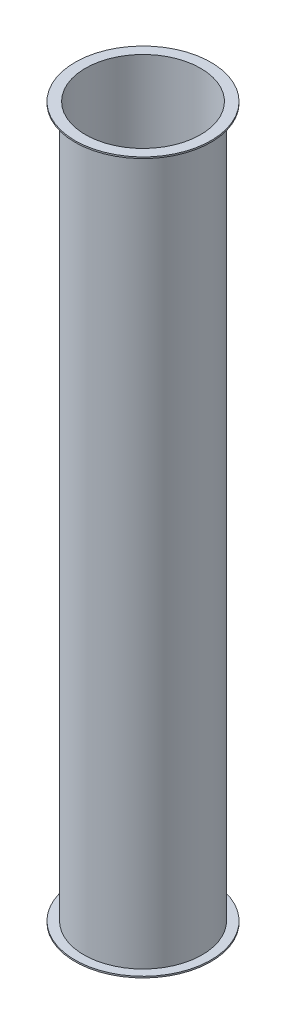
ISO-10303-21;
HEADER;
FILE_DESCRIPTION(('STEP AP214'),'2;1');
FILE_NAME('part.step','',(''),(''),'','','');
FILE_SCHEMA(('AUTOMOTIVE_DESIGN { 1 0 10303 214 1 1 1 1 }'));
ENDSEC;
DATA;
#1=APPLICATION_CONTEXT('core data for automotive mechanical design processes');
#2=APPLICATION_PROTOCOL_DEFINITION('international standard','automotive_design',2000,#1);
#3=PRODUCT_CONTEXT('',#1,'mechanical');
#4=PRODUCT('Part','Part','',(#3));
#5=PRODUCT_RELATED_PRODUCT_CATEGORY('part','',(#4));
#6=PRODUCT_DEFINITION_FORMATION('','',#4);
#7=PRODUCT_DEFINITION_CONTEXT('part definition',#1,'design');
#8=PRODUCT_DEFINITION('design','',#6,#7);
#9=PRODUCT_DEFINITION_SHAPE('','',#8);
#10=(LENGTH_UNIT() NAMED_UNIT(*) SI_UNIT(.MILLI.,.METRE.));
#11=(NAMED_UNIT(*) PLANE_ANGLE_UNIT() SI_UNIT($,.RADIAN.));
#12=(NAMED_UNIT(*) SI_UNIT($,.STERADIAN.) SOLID_ANGLE_UNIT());
#13=UNCERTAINTY_MEASURE_WITH_UNIT(LENGTH_MEASURE(1.E-05),#10,'distance_accuracy_value','');
#14=(GEOMETRIC_REPRESENTATION_CONTEXT(3) GLOBAL_UNCERTAINTY_ASSIGNED_CONTEXT((#13)) GLOBAL_UNIT_ASSIGNED_CONTEXT((#10,
#11,#12)) REPRESENTATION_CONTEXT('',''));
#15=CARTESIAN_POINT('',(0.,0.,0.));
#16=DIRECTION('',(0.,0.,1.));
#17=DIRECTION('',(1.,0.,0.));
#18=AXIS2_PLACEMENT_3D('',#15,#16,#17);
#19=CARTESIAN_POINT('',(0.,481.5,0.));
#20=DIRECTION('',(0.,-1.,0.));
#21=DIRECTION('',(0.,0.,-1.));
#22=AXIS2_PLACEMENT_3D('',#19,#20,#21);
#23=CYLINDRICAL_SURFACE('',#22,40.);
#24=CARTESIAN_POINT('',(0.,480.5,0.));
#25=DIRECTION('',(0.,1.,0.));
#26=DIRECTION('',(0.,0.,1.));
#27=AXIS2_PLACEMENT_3D('',#24,#25,#26);
#28=CIRCLE('',#27,40.);
#29=CARTESIAN_POINT('',(0.,480.5,-40.));
#30=VERTEX_POINT('',#29);
#31=EDGE_CURVE('E43',#30,#30,#28,.T.);
#32=CARTESIAN_POINT('',(0.,1.,0.));
#33=DIRECTION('',(0.,-1.,0.));
#34=DIRECTION('',(0.,0.,-1.));
#35=AXIS2_PLACEMENT_3D('',#32,#33,#34);
#36=CIRCLE('',#35,40.);
#37=CARTESIAN_POINT('',(0.,1.,-40.));
#38=VERTEX_POINT('',#37);
#39=EDGE_CURVE('E11',#38,#38,#36,.T.);
#40=CARTESIAN_POINT('',(0.,480.5,-40.));
#41=CARTESIAN_POINT('',(0.,475.505208333333,-40.));
#42=CARTESIAN_POINT('',(0.,470.510416666667,-40.));
#43=CARTESIAN_POINT('',(0.,460.520833333333,-40.));
#44=CARTESIAN_POINT('',(0.,455.526041666667,-40.));
#45=CARTESIAN_POINT('',(0.,445.536458333333,-40.));
#46=CARTESIAN_POINT('',(0.,440.541666666667,-40.));
#47=CARTESIAN_POINT('',(0.,430.552083333333,-40.));
#48=CARTESIAN_POINT('',(0.,425.557291666667,-40.));
#49=CARTESIAN_POINT('',(0.,415.567708333333,-40.));
#50=CARTESIAN_POINT('',(0.,410.572916666667,-40.));
#51=CARTESIAN_POINT('',(0.,400.583333333333,-40.));
#52=CARTESIAN_POINT('',(0.,395.588541666667,-40.));
#53=CARTESIAN_POINT('',(0.,385.598958333333,-40.));
#54=CARTESIAN_POINT('',(0.,380.604166666667,-40.));
#55=CARTESIAN_POINT('',(0.,370.614583333333,-40.));
#56=CARTESIAN_POINT('',(0.,365.619791666667,-40.));
#57=CARTESIAN_POINT('',(0.,355.630208333333,-40.));
#58=CARTESIAN_POINT('',(0.,350.635416666667,-40.));
#59=CARTESIAN_POINT('',(0.,340.645833333333,-40.));
#60=CARTESIAN_POINT('',(0.,335.651041666667,-40.));
#61=CARTESIAN_POINT('',(0.,325.661458333333,-40.));
#62=CARTESIAN_POINT('',(0.,320.666666666667,-40.));
#63=CARTESIAN_POINT('',(0.,310.677083333333,-40.));
#64=CARTESIAN_POINT('',(0.,305.682291666667,-40.));
#65=CARTESIAN_POINT('',(0.,295.692708333333,-40.));
#66=CARTESIAN_POINT('',(0.,290.697916666667,-40.));
#67=CARTESIAN_POINT('',(0.,280.708333333333,-40.));
#68=CARTESIAN_POINT('',(0.,275.713541666667,-40.));
#69=CARTESIAN_POINT('',(0.,265.723958333333,-40.));
#70=CARTESIAN_POINT('',(0.,260.729166666667,-40.));
#71=CARTESIAN_POINT('',(0.,250.739583333333,-40.));
#72=CARTESIAN_POINT('',(0.,245.744791666667,-40.));
#73=CARTESIAN_POINT('',(0.,235.755208333333,-40.));
#74=CARTESIAN_POINT('',(0.,230.760416666667,-40.));
#75=CARTESIAN_POINT('',(0.,220.770833333333,-40.));
#76=CARTESIAN_POINT('',(0.,215.776041666667,-40.));
#77=CARTESIAN_POINT('',(0.,205.786458333333,-40.));
#78=CARTESIAN_POINT('',(0.,200.791666666667,-40.));
#79=CARTESIAN_POINT('',(0.,190.802083333333,-40.));
#80=CARTESIAN_POINT('',(0.,185.807291666667,-40.));
#81=CARTESIAN_POINT('',(0.,175.817708333333,-40.));
#82=CARTESIAN_POINT('',(0.,170.822916666667,-40.));
#83=CARTESIAN_POINT('',(0.,160.833333333333,-40.));
#84=CARTESIAN_POINT('',(0.,155.838541666667,-40.));
#85=CARTESIAN_POINT('',(0.,145.848958333333,-40.));
#86=CARTESIAN_POINT('',(0.,140.854166666667,-40.));
#87=CARTESIAN_POINT('',(0.,130.864583333333,-40.));
#88=CARTESIAN_POINT('',(0.,125.869791666667,-40.));
#89=CARTESIAN_POINT('',(0.,115.880208333333,-40.));
#90=CARTESIAN_POINT('',(0.,110.885416666667,-40.));
#91=CARTESIAN_POINT('',(0.,100.895833333333,-40.));
#92=CARTESIAN_POINT('',(0.,95.9010416666666,-40.));
#93=CARTESIAN_POINT('',(0.,85.9114583333333,-40.));
#94=CARTESIAN_POINT('',(0.,80.9166666666667,-40.));
#95=CARTESIAN_POINT('',(0.,70.9270833333333,-40.));
#96=CARTESIAN_POINT('',(0.,65.9322916666667,-40.));
#97=CARTESIAN_POINT('',(0.,55.9427083333333,-40.));
#98=CARTESIAN_POINT('',(0.,50.9479166666666,-40.));
#99=CARTESIAN_POINT('',(0.,40.9583333333333,-40.));
#100=CARTESIAN_POINT('',(0.,35.9635416666666,-40.));
#101=CARTESIAN_POINT('',(0.,25.9739583333333,-40.));
#102=CARTESIAN_POINT('',(0.,20.9791666666666,-40.));
#103=CARTESIAN_POINT('',(0.,10.9895833333333,-40.));
#104=CARTESIAN_POINT('',(0.,5.99479166666666,-40.));
#105=CARTESIAN_POINT('',(0.,1.,-40.));
#106=B_SPLINE_CURVE_WITH_KNOTS('',3,(#40,#41,#42,#43,#44,#45,#46,#47,#48,#49,#50,#51,#52,#53,
#54,#55,#56,#57,#58,#59,#60,#61,#62,#63,#64,#65,#66,#67,#68,#69,#70,#71,#72,#73,#74,#75,#76,#77,
#78,#79,#80,#81,#82,#83,#84,#85,#86,#87,#88,#89,#90,#91,#92,#93,#94,#95,#96,#97,#98,#99,#100,
#101,#102,#103,#104,#105),.UNSPECIFIED.,.F.,.F.,(4,2,2,2,2,2,2,2,2,2,2,2,2,2,2,2,2,2,2,2,2,2,2,
2,2,2,2,2,2,2,2,2,4),(0.,14.984375,29.96875,44.953125,59.9375,74.921875,89.90625,104.890625,
119.875,134.859375,149.84375,164.828125,179.8125,194.796875,209.78125,224.765625,239.75,
254.734375,269.71875,284.703125,299.6875,314.671875,329.65625,344.640625,359.625,374.609375,
389.59375,404.578125,419.5625,434.546875,449.53125,464.515625,479.5),.UNSPECIFIED.);
#107=EDGE_CURVE('BSEAM37',#30,#38,#106,.T.);
#108=ORIENTED_EDGE('',*,*,#31,.F.);
#109=ORIENTED_EDGE('',*,*,#39,.F.);
#110=ORIENTED_EDGE('',*,*,#107,.T.);
#111=ORIENTED_EDGE('',*,*,#107,.F.);
#112=EDGE_LOOP('',(#108,#110,#109,#111));
#113=FACE_BOUND('',#112,.T.);
#114=ADVANCED_FACE('F37',(#113),#23,.T.);
#115=CARTESIAN_POINT('',(0.,481.5,0.));
#116=DIRECTION('',(0.,1.,0.));
#117=DIRECTION('',(0.,0.,1.));
#118=AXIS2_PLACEMENT_3D('',#115,#116,#117);
#119=PLANE('',#118);
#120=CARTESIAN_POINT('',(0.,481.5,0.));
#121=DIRECTION('',(0.,1.,0.));
#122=DIRECTION('',(1.,0.,0.));
#123=AXIS2_PLACEMENT_3D('',#120,#121,#122);
#124=CIRCLE('',#123,39.);
#125=CARTESIAN_POINT('',(0.,481.5,-39.));
#126=VERTEX_POINT('',#125);
#127=EDGE_CURVE('E47',#126,#126,#124,.T.);
#128=ORIENTED_EDGE('',*,*,#127,.F.);
#129=EDGE_LOOP('',(#128));
#130=FACE_BOUND('',#129,.T.);
#131=CARTESIAN_POINT('',(0.,481.5,0.));
#132=DIRECTION('',(0.,1.,0.));
#133=DIRECTION('',(0.,0.,1.));
#134=AXIS2_PLACEMENT_3D('',#131,#132,#133);
#135=CIRCLE('',#134,46.);
#136=CARTESIAN_POINT('',(0.,481.5,46.));
#137=VERTEX_POINT('',#136);
#138=EDGE_CURVE('E57',#137,#137,#135,.T.);
#139=ORIENTED_EDGE('',*,*,#138,.T.);
#140=EDGE_LOOP('',(#139));
#141=FACE_BOUND('',#140,.T.);
#142=ADVANCED_FACE('F81',(#130,#141),#119,.T.);
#143=CARTESIAN_POINT('',(0.,0.,0.));
#144=DIRECTION('',(0.,1.,0.));
#145=DIRECTION('',(0.,0.,1.));
#146=AXIS2_PLACEMENT_3D('',#143,#144,#145);
#147=PLANE('',#146);
#148=CARTESIAN_POINT('',(0.,0.,0.));
#149=DIRECTION('',(0.,1.,0.));
#150=DIRECTION('',(1.,0.,0.));
#151=AXIS2_PLACEMENT_3D('',#148,#149,#150);
#152=CIRCLE('',#151,39.);
#153=CARTESIAN_POINT('',(0.,0.,-39.));
#154=VERTEX_POINT('',#153);
#155=EDGE_CURVE('E51',#154,#154,#152,.T.);
#156=ORIENTED_EDGE('',*,*,#155,.T.);
#157=EDGE_LOOP('',(#156));
#158=FACE_BOUND('',#157,.T.);
#159=CARTESIAN_POINT('',(0.,0.,0.));
#160=DIRECTION('',(0.,-1.,0.));
#161=DIRECTION('',(0.,0.,-1.));
#162=AXIS2_PLACEMENT_3D('',#159,#160,#161);
#163=CIRCLE('',#162,46.);
#164=CARTESIAN_POINT('',(0.,0.,-46.));
#165=VERTEX_POINT('',#164);
#166=EDGE_CURVE('E63',#165,#165,#163,.T.);
#167=ORIENTED_EDGE('',*,*,#166,.T.);
#168=EDGE_LOOP('',(#167));
#169=FACE_BOUND('',#168,.T.);
#170=ADVANCED_FACE('F86',(#158,#169),#147,.F.);
#171=CARTESIAN_POINT('',(0.,481.5,0.));
#172=DIRECTION('',(0.,-1.,0.));
#173=DIRECTION('',(0.,0.,-1.));
#174=AXIS2_PLACEMENT_3D('',#171,#172,#173);
#175=CYLINDRICAL_SURFACE('',#174,39.);
#176=CARTESIAN_POINT('',(0.,481.5,-39.));
#177=CARTESIAN_POINT('',(0.,476.484375,-39.));
#178=CARTESIAN_POINT('',(0.,471.46875,-39.));
#179=CARTESIAN_POINT('',(0.,461.4375,-39.));
#180=CARTESIAN_POINT('',(0.,456.421875,-39.));
#181=CARTESIAN_POINT('',(0.,446.390625,-39.));
#182=CARTESIAN_POINT('',(0.,441.375,-39.));
#183=CARTESIAN_POINT('',(0.,431.34375,-39.));
#184=CARTESIAN_POINT('',(0.,426.328125,-39.));
#185=CARTESIAN_POINT('',(0.,416.296875,-39.));
#186=CARTESIAN_POINT('',(0.,411.28125,-39.));
#187=CARTESIAN_POINT('',(0.,401.25,-39.));
#188=CARTESIAN_POINT('',(0.,396.234375,-39.));
#189=CARTESIAN_POINT('',(0.,386.203125,-39.));
#190=CARTESIAN_POINT('',(0.,381.1875,-39.));
#191=CARTESIAN_POINT('',(0.,371.15625,-39.));
#192=CARTESIAN_POINT('',(0.,366.140625,-39.));
#193=CARTESIAN_POINT('',(0.,356.109375,-39.));
#194=CARTESIAN_POINT('',(0.,351.09375,-39.));
#195=CARTESIAN_POINT('',(0.,341.0625,-39.));
#196=CARTESIAN_POINT('',(0.,336.046875,-39.));
#197=CARTESIAN_POINT('',(0.,326.015625,-39.));
#198=CARTESIAN_POINT('',(0.,321.,-39.));
#199=CARTESIAN_POINT('',(0.,310.96875,-39.));
#200=CARTESIAN_POINT('',(0.,305.953125,-39.));
#201=CARTESIAN_POINT('',(0.,295.921875,-39.));
#202=CARTESIAN_POINT('',(0.,290.90625,-39.));
#203=CARTESIAN_POINT('',(0.,280.875,-39.));
#204=CARTESIAN_POINT('',(0.,275.859375,-39.));
#205=CARTESIAN_POINT('',(0.,265.828125,-39.));
#206=CARTESIAN_POINT('',(0.,260.8125,-39.));
#207=CARTESIAN_POINT('',(0.,250.78125,-39.));
#208=CARTESIAN_POINT('',(0.,245.765625,-39.));
#209=CARTESIAN_POINT('',(0.,235.734375,-39.));
#210=CARTESIAN_POINT('',(0.,230.71875,-39.));
#211=CARTESIAN_POINT('',(0.,220.6875,-39.));
#212=CARTESIAN_POINT('',(0.,215.671875,-39.));
#213=CARTESIAN_POINT('',(0.,205.640625,-39.));
#214=CARTESIAN_POINT('',(0.,200.625,-39.));
#215=CARTESIAN_POINT('',(0.,190.59375,-39.));
#216=CARTESIAN_POINT('',(0.,185.578125,-39.));
#217=CARTESIAN_POINT('',(0.,175.546875,-39.));
#218=CARTESIAN_POINT('',(0.,170.53125,-39.));
#219=CARTESIAN_POINT('',(0.,160.5,-39.));
#220=CARTESIAN_POINT('',(0.,155.484375,-39.));
#221=CARTESIAN_POINT('',(0.,145.453125,-39.));
#222=CARTESIAN_POINT('',(0.,140.4375,-39.));
#223=CARTESIAN_POINT('',(0.,130.40625,-39.));
#224=CARTESIAN_POINT('',(0.,125.390625,-39.));
#225=CARTESIAN_POINT('',(0.,115.359375,-39.));
#226=CARTESIAN_POINT('',(0.,110.34375,-39.));
#227=CARTESIAN_POINT('',(0.,100.3125,-39.));
#228=CARTESIAN_POINT('',(0.,95.296875,-39.));
#229=CARTESIAN_POINT('',(0.,85.265625,-39.));
#230=CARTESIAN_POINT('',(0.,80.25,-39.));
#231=CARTESIAN_POINT('',(0.,70.21875,-39.));
#232=CARTESIAN_POINT('',(0.,65.203125,-39.));
#233=CARTESIAN_POINT('',(0.,55.171875,-39.));
#234=CARTESIAN_POINT('',(0.,50.15625,-39.));
#235=CARTESIAN_POINT('',(0.,40.125,-39.));
#236=CARTESIAN_POINT('',(0.,35.109375,-39.));
#237=CARTESIAN_POINT('',(0.,25.078125,-39.));
#238=CARTESIAN_POINT('',(0.,20.0625,-39.));
#239=CARTESIAN_POINT('',(0.,10.03125,-39.));
#240=CARTESIAN_POINT('',(0.,5.01562499999999,-39.));
#241=CARTESIAN_POINT('',(0.,0.,-39.));
#242=B_SPLINE_CURVE_WITH_KNOTS('',3,(#176,#177,#178,#179,#180,#181,#182,#183,#184,#185,#186,
#187,#188,#189,#190,#191,#192,#193,#194,#195,#196,#197,#198,#199,#200,#201,#202,#203,#204,#205,
#206,#207,#208,#209,#210,#211,#212,#213,#214,#215,#216,#217,#218,#219,#220,#221,#222,#223,#224,
#225,#226,#227,#228,#229,#230,#231,#232,#233,#234,#235,#236,#237,#238,#239,#240,#241),
.UNSPECIFIED.,.F.,.F.,(4,2,2,2,2,2,2,2,2,2,2,2,2,2,2,2,2,2,2,2,2,2,2,2,2,2,2,2,2,2,2,2,4),(0.,
15.046875,30.09375,45.1406249999999,60.1875,75.234375,90.28125,105.328125,120.375,135.421875,
150.46875,165.515625,180.5625,195.609375,210.65625,225.703125,240.75,255.796875,270.84375,
285.890625,300.9375,315.984375,331.03125,346.078125,361.125,376.171875,391.21875,406.265625,
421.3125,436.359375,451.40625,466.453125,481.5),.UNSPECIFIED.);
#243=EDGE_CURVE('BSEAM93',#126,#154,#242,.T.);
#244=ORIENTED_EDGE('',*,*,#127,.T.);
#245=ORIENTED_EDGE('',*,*,#155,.F.);
#246=ORIENTED_EDGE('',*,*,#243,.T.);
#247=ORIENTED_EDGE('',*,*,#243,.F.);
#248=EDGE_LOOP('',(#244,#246,#245,#247));
#249=FACE_BOUND('',#248,.T.);
#250=ADVANCED_FACE('F93',(#249),#175,.F.);
#251=CARTESIAN_POINT('',(0.,480.5,0.));
#252=DIRECTION('',(0.,1.,0.));
#253=DIRECTION('',(0.,0.,1.));
#254=AXIS2_PLACEMENT_3D('',#251,#252,#253);
#255=CYLINDRICAL_SURFACE('',#254,46.);
#256=CARTESIAN_POINT('',(0.,480.5,0.));
#257=DIRECTION('',(0.,1.,0.));
#258=DIRECTION('',(0.,0.,1.));
#259=AXIS2_PLACEMENT_3D('',#256,#257,#258);
#260=CIRCLE('',#259,46.);
#261=CARTESIAN_POINT('',(0.,480.5,46.));
#262=VERTEX_POINT('',#261);
#263=EDGE_CURVE('E55',#262,#262,#260,.T.);
#264=ORIENTED_EDGE('',*,*,#263,.T.);
#265=EDGE_LOOP('',(#264));
#266=FACE_BOUND('',#265,.T.);
#267=ORIENTED_EDGE('',*,*,#138,.F.);
#268=EDGE_LOOP('',(#267));
#269=FACE_BOUND('',#268,.T.);
#270=ADVANCED_FACE('F100',(#266,#269),#255,.T.);
#271=CARTESIAN_POINT('',(0.,480.5,0.));
#272=DIRECTION('',(0.,1.,0.));
#273=DIRECTION('',(0.,0.,1.));
#274=AXIS2_PLACEMENT_3D('',#271,#272,#273);
#275=PLANE('',#274);
#276=ORIENTED_EDGE('',*,*,#31,.T.);
#277=EDGE_LOOP('',(#276));
#278=FACE_BOUND('',#277,.T.);
#279=ORIENTED_EDGE('',*,*,#263,.F.);
#280=EDGE_LOOP('',(#279));
#281=FACE_BOUND('',#280,.T.);
#282=ADVANCED_FACE('F78',(#278,#281),#275,.F.);
#283=CARTESIAN_POINT('',(0.,1.,0.));
#284=DIRECTION('',(0.,-1.,0.));
#285=DIRECTION('',(0.,0.,-1.));
#286=AXIS2_PLACEMENT_3D('',#283,#284,#285);
#287=CYLINDRICAL_SURFACE('',#286,46.);
#288=CARTESIAN_POINT('',(0.,1.,0.));
#289=DIRECTION('',(0.,-1.,0.));
#290=DIRECTION('',(0.,0.,-1.));
#291=AXIS2_PLACEMENT_3D('',#288,#289,#290);
#292=CIRCLE('',#291,46.);
#293=CARTESIAN_POINT('',(0.,1.,-46.));
#294=VERTEX_POINT('',#293);
#295=EDGE_CURVE('E60',#294,#294,#292,.T.);
#296=ORIENTED_EDGE('',*,*,#295,.T.);
#297=EDGE_LOOP('',(#296));
#298=FACE_BOUND('',#297,.T.);
#299=ORIENTED_EDGE('',*,*,#166,.F.);
#300=EDGE_LOOP('',(#299));
#301=FACE_BOUND('',#300,.T.);
#302=ADVANCED_FACE('F69',(#298,#301),#287,.T.);
#303=CARTESIAN_POINT('',(0.,1.,0.));
#304=DIRECTION('',(0.,-1.,0.));
#305=DIRECTION('',(0.,0.,-1.));
#306=AXIS2_PLACEMENT_3D('',#303,#304,#305);
#307=PLANE('',#306);
#308=ORIENTED_EDGE('',*,*,#39,.T.);
#309=EDGE_LOOP('',(#308));
#310=FACE_BOUND('',#309,.T.);
#311=ORIENTED_EDGE('',*,*,#295,.F.);
#312=EDGE_LOOP('',(#311));
#313=FACE_BOUND('',#312,.T.);
#314=ADVANCED_FACE('F72',(#310,#313),#307,.F.);
#315=CLOSED_SHELL('',(#114,#142,#170,#250,#270,#282,#302,#314));
#316=MANIFOLD_SOLID_BREP('B2',#315);
#317=ADVANCED_BREP_SHAPE_REPRESENTATION('',(#18,#316),#14);
#318=SHAPE_DEFINITION_REPRESENTATION(#9,#317);
ENDSEC;
END-ISO-10303-21;
